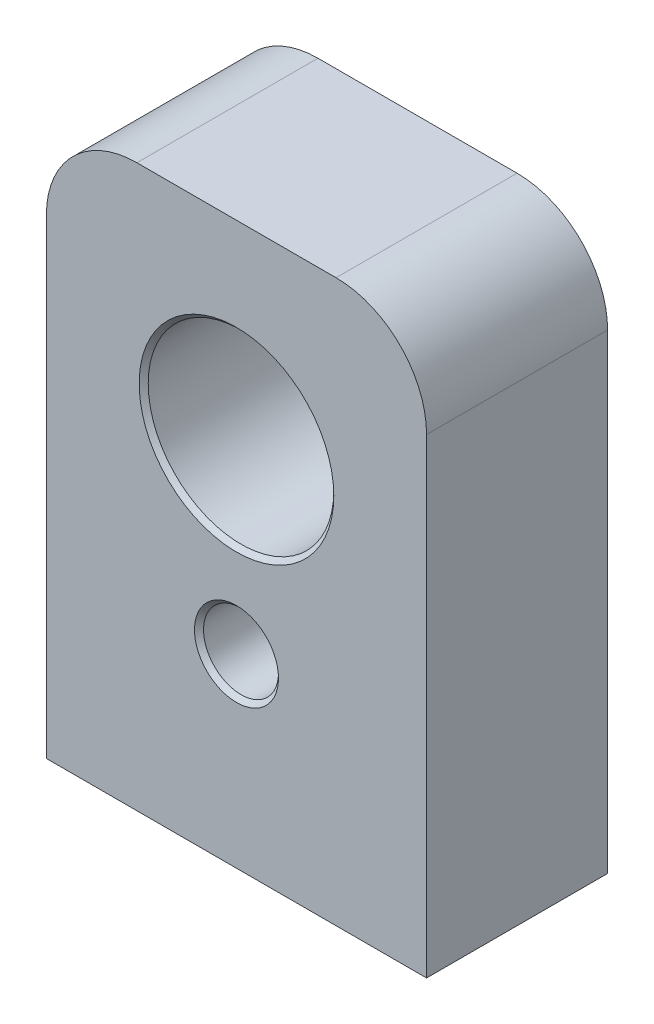
ISO-10303-21;
HEADER;
FILE_DESCRIPTION(('STEP AP214'),'2;1');
FILE_NAME('part.step','',(''),(''),'','','');
FILE_SCHEMA(('AUTOMOTIVE_DESIGN { 1 0 10303 214 1 1 1 1 }'));
ENDSEC;
DATA;
#1=APPLICATION_CONTEXT('core data for automotive mechanical design processes');
#2=APPLICATION_PROTOCOL_DEFINITION('international standard','automotive_design',2000,#1);
#3=PRODUCT_CONTEXT('',#1,'mechanical');
#4=PRODUCT('Part','Part','',(#3));
#5=PRODUCT_RELATED_PRODUCT_CATEGORY('part','',(#4));
#6=PRODUCT_DEFINITION_FORMATION('','',#4);
#7=PRODUCT_DEFINITION_CONTEXT('part definition',#1,'design');
#8=PRODUCT_DEFINITION('design','',#6,#7);
#9=PRODUCT_DEFINITION_SHAPE('','',#8);
#10=(LENGTH_UNIT() NAMED_UNIT(*) SI_UNIT(.MILLI.,.METRE.));
#11=(NAMED_UNIT(*) PLANE_ANGLE_UNIT() SI_UNIT($,.RADIAN.));
#12=(NAMED_UNIT(*) SI_UNIT($,.STERADIAN.) SOLID_ANGLE_UNIT());
#13=UNCERTAINTY_MEASURE_WITH_UNIT(LENGTH_MEASURE(1.E-05),#10,'distance_accuracy_value','');
#14=(GEOMETRIC_REPRESENTATION_CONTEXT(3) GLOBAL_UNCERTAINTY_ASSIGNED_CONTEXT((#13)) GLOBAL_UNIT_ASSIGNED_CONTEXT((#10,
#11,#12)) REPRESENTATION_CONTEXT('',''));
#15=CARTESIAN_POINT('',(0.,0.,0.));
#16=DIRECTION('',(0.,0.,1.));
#17=DIRECTION('',(1.,0.,0.));
#18=AXIS2_PLACEMENT_3D('',#15,#16,#17);
#19=CARTESIAN_POINT('',(-39.44489648097,-31.5193474057694,-10.));
#20=DIRECTION('',(0.,-1.,0.));
#21=DIRECTION('',(1.,0.,0.));
#22=AXIS2_PLACEMENT_3D('',#19,#20,#21);
#23=PLANE('',#22);
#24=DIRECTION('',(-0.866025403784438,0.,0.5));
#25=VECTOR('',#24,1.);
#26=CARTESIAN_POINT('',(-30.6303139186706,-31.5193474057694,1.625));
#27=LINE('',#26,#25);
#28=CARTESIAN_POINT('',(-30.6303139186706,-31.5193474057694,1.625));
#29=VERTEX_POINT('',#28);
#30=CARTESIAN_POINT('',(-33.44489648097,-31.5193474057694,3.25));
#31=VERTEX_POINT('',#30);
#32=EDGE_CURVE('E59',#29,#31,#27,.T.);
#33=ORIENTED_EDGE('',*,*,#32,.F.);
#34=DIRECTION('',(0.,0.,1.));
#35=VECTOR('',#34,1.);
#36=CARTESIAN_POINT('',(-30.6303139186706,-31.5193474057694,-1.625));
#37=LINE('',#36,#35);
#38=CARTESIAN_POINT('',(-30.6303139186706,-31.5193474057694,-1.625));
#39=VERTEX_POINT('',#38);
#40=EDGE_CURVE('E218',#39,#29,#37,.T.);
#41=ORIENTED_EDGE('',*,*,#40,.F.);
#42=DIRECTION('',(0.866025403784439,0.,0.5));
#43=VECTOR('',#42,1.);
#44=CARTESIAN_POINT('',(-33.44489648097,-31.5193474057694,-3.25));
#45=LINE('',#44,#43);
#46=CARTESIAN_POINT('',(-33.44489648097,-31.5193474057694,-3.25));
#47=VERTEX_POINT('',#46);
#48=EDGE_CURVE('E244',#47,#39,#45,.T.);
#49=ORIENTED_EDGE('',*,*,#48,.F.);
#50=DIRECTION('',(0.866025403784438,0.,-0.5));
#51=VECTOR('',#50,1.);
#52=CARTESIAN_POINT('',(-36.2594790432695,-31.5193474057694,-1.625));
#53=LINE('',#52,#51);
#54=CARTESIAN_POINT('',(-36.2594790432695,-31.5193474057694,-1.625));
#55=VERTEX_POINT('',#54);
#56=EDGE_CURVE('E241',#55,#47,#53,.T.);
#57=ORIENTED_EDGE('',*,*,#56,.F.);
#58=DIRECTION('',(0.,0.,-1.));
#59=VECTOR('',#58,1.);
#60=CARTESIAN_POINT('',(-36.2594790432695,-31.5193474057694,1.625));
#61=LINE('',#60,#59);
#62=CARTESIAN_POINT('',(-36.2594790432695,-31.5193474057694,1.625));
#63=VERTEX_POINT('',#62);
#64=EDGE_CURVE('E238',#63,#55,#61,.T.);
#65=ORIENTED_EDGE('',*,*,#64,.F.);
#66=DIRECTION('',(-0.866025403784439,0.,-0.5));
#67=VECTOR('',#66,1.);
#68=CARTESIAN_POINT('',(-33.44489648097,-31.5193474057694,3.25));
#69=LINE('',#68,#67);
#70=EDGE_CURVE('E235',#31,#63,#69,.T.);
#71=ORIENTED_EDGE('',*,*,#70,.F.);
#72=EDGE_LOOP('',(#33,#41,#49,#57,#65,#71));
#73=FACE_BOUND('',#72,.T.);
#74=DIRECTION('',(1.,0.,0.));
#75=VECTOR('',#74,1.);
#76=CARTESIAN_POINT('',(-39.44489648097,-31.5193474057694,10.));
#77=LINE('',#76,#75);
#78=CARTESIAN_POINT('',(-39.44489648097,-31.5193474057694,10.));
#79=VERTEX_POINT('',#78);
#80=CARTESIAN_POINT('',(2.55510351902963,-31.5193474057693,10.));
#81=VERTEX_POINT('',#80);
#82=EDGE_CURVE('E251',#79,#81,#77,.T.);
#83=ORIENTED_EDGE('',*,*,#82,.F.);
#84=DIRECTION('',(0.,0.,1.));
#85=VECTOR('',#84,1.);
#86=CARTESIAN_POINT('',(-39.44489648097,-31.5193474057694,-10.));
#87=LINE('',#86,#85);
#88=CARTESIAN_POINT('',(-39.44489648097,-31.5193474057694,-10.));
#89=VERTEX_POINT('',#88);
#90=EDGE_CURVE('E297',#89,#79,#87,.T.);
#91=ORIENTED_EDGE('',*,*,#90,.F.);
#92=DIRECTION('',(1.,0.,0.));
#93=VECTOR('',#92,1.);
#94=CARTESIAN_POINT('',(-39.44489648097,-31.5193474057694,-10.));
#95=LINE('',#94,#93);
#96=CARTESIAN_POINT('',(2.55510351902963,-31.5193474057693,-10.));
#97=VERTEX_POINT('',#96);
#98=EDGE_CURVE('E261',#89,#97,#95,.T.);
#99=ORIENTED_EDGE('',*,*,#98,.T.);
#100=DIRECTION('',(0.,0.,1.));
#101=VECTOR('',#100,1.);
#102=CARTESIAN_POINT('',(2.55510351902963,-31.5193474057693,-10.));
#103=LINE('',#102,#101);
#104=EDGE_CURVE('E280',#97,#81,#103,.T.);
#105=ORIENTED_EDGE('',*,*,#104,.T.);
#106=EDGE_LOOP('',(#83,#91,#99,#105));
#107=FACE_BOUND('',#106,.T.);
#108=DIRECTION('',(0.,0.,1.));
#109=VECTOR('',#108,1.);
#110=CARTESIAN_POINT('',(-6.25947904326998,-31.5193474057692,-1.625));
#111=LINE('',#110,#109);
#112=CARTESIAN_POINT('',(-6.25947904326998,-31.5193474057692,-1.625));
#113=VERTEX_POINT('',#112);
#114=CARTESIAN_POINT('',(-6.25947904326998,-31.5193474057693,1.625));
#115=VERTEX_POINT('',#114);
#116=EDGE_CURVE('E195',#113,#115,#111,.T.);
#117=ORIENTED_EDGE('',*,*,#116,.T.);
#118=DIRECTION('',(0.866025403784438,0.,0.5));
#119=VECTOR('',#118,1.);
#120=CARTESIAN_POINT('',(-6.25947904326998,-31.5193474057692,1.625));
#121=LINE('',#120,#119);
#122=CARTESIAN_POINT('',(-3.44489648097056,-31.5193474057692,3.25));
#123=VERTEX_POINT('',#122);
#124=EDGE_CURVE('E51',#115,#123,#121,.T.);
#125=ORIENTED_EDGE('',*,*,#124,.T.);
#126=DIRECTION('',(0.866025403784439,0.,-0.5));
#127=VECTOR('',#126,1.);
#128=CARTESIAN_POINT('',(-3.44489648097056,-31.5193474057692,3.25));
#129=LINE('',#128,#127);
#130=CARTESIAN_POINT('',(-0.630313918671126,-31.5193474057692,1.625));
#131=VERTEX_POINT('',#130);
#132=EDGE_CURVE('E182',#123,#131,#129,.T.);
#133=ORIENTED_EDGE('',*,*,#132,.T.);
#134=DIRECTION('',(0.,0.,-1.));
#135=VECTOR('',#134,1.);
#136=CARTESIAN_POINT('',(-0.630313918671126,-31.5193474057692,1.625));
#137=LINE('',#136,#135);
#138=CARTESIAN_POINT('',(-0.630313918671126,-31.5193474057692,-1.625));
#139=VERTEX_POINT('',#138);
#140=EDGE_CURVE('E185',#131,#139,#137,.T.);
#141=ORIENTED_EDGE('',*,*,#140,.T.);
#142=DIRECTION('',(-0.866025403784438,0.,-0.5));
#143=VECTOR('',#142,1.);
#144=CARTESIAN_POINT('',(-0.630313918671126,-31.5193474057692,-1.625));
#145=LINE('',#144,#143);
#146=CARTESIAN_POINT('',(-3.44489648097055,-31.5193474057692,-3.25));
#147=VERTEX_POINT('',#146);
#148=EDGE_CURVE('E200',#139,#147,#145,.T.);
#149=ORIENTED_EDGE('',*,*,#148,.T.);
#150=DIRECTION('',(-0.866025403784439,0.,0.5));
#151=VECTOR('',#150,1.);
#152=CARTESIAN_POINT('',(-3.44489648097055,-31.5193474057692,-3.25));
#153=LINE('',#152,#151);
#154=EDGE_CURVE('E197',#147,#113,#153,.T.);
#155=ORIENTED_EDGE('',*,*,#154,.T.);
#156=EDGE_LOOP('',(#117,#125,#133,#141,#149,#155));
#157=FACE_BOUND('',#156,.T.);
#158=ADVANCED_FACE('F35',(#73,#107,#157),#23,.T.);
#159=CARTESIAN_POINT('',(-39.4448964809704,20.4806525942305,-10.));
#160=DIRECTION('',(-1.,0.,0.));
#161=DIRECTION('',(0.,-1.,0.));
#162=AXIS2_PLACEMENT_3D('',#159,#160,#161);
#163=PLANE('',#162);
#164=DIRECTION('',(0.,-1.,0.));
#165=VECTOR('',#164,1.);
#166=CARTESIAN_POINT('',(-39.4448964809704,20.4806525942305,10.));
#167=LINE('',#166,#165);
#168=CARTESIAN_POINT('',(-39.4448964809704,20.4806525942305,10.));
#169=VERTEX_POINT('',#168);
#170=EDGE_CURVE('E265',#169,#79,#167,.T.);
#171=ORIENTED_EDGE('',*,*,#170,.F.);
#172=DIRECTION('',(0.,0.,1.));
#173=VECTOR('',#172,1.);
#174=CARTESIAN_POINT('',(-39.4448964809704,20.4806525942305,-10.));
#175=LINE('',#174,#173);
#176=CARTESIAN_POINT('',(-39.4448964809704,20.4806525942305,-10.));
#177=VERTEX_POINT('',#176);
#178=EDGE_CURVE('E300',#177,#169,#175,.T.);
#179=ORIENTED_EDGE('',*,*,#178,.F.);
#180=DIRECTION('',(0.,-1.,0.));
#181=VECTOR('',#180,1.);
#182=CARTESIAN_POINT('',(-39.4448964809704,20.4806525942305,-10.));
#183=LINE('',#182,#181);
#184=EDGE_CURVE('E277',#177,#89,#183,.T.);
#185=ORIENTED_EDGE('',*,*,#184,.T.);
#186=ORIENTED_EDGE('',*,*,#90,.T.);
#187=EDGE_LOOP('',(#171,#179,#185,#186));
#188=FACE_BOUND('',#187,.T.);
#189=ADVANCED_FACE('F344',(#188),#163,.T.);
#190=CARTESIAN_POINT('',(-29.4448964809704,20.4806525942305,-10.));
#191=DIRECTION('',(0.,0.,1.));
#192=DIRECTION('',(1.,0.,0.));
#193=AXIS2_PLACEMENT_3D('',#190,#191,#192);
#194=CYLINDRICAL_SURFACE('',#193,10.);
#195=CARTESIAN_POINT('',(-29.4448964809704,20.4806525942305,10.));
#196=DIRECTION('',(0.,0.,1.));
#197=DIRECTION('',(-1.,0.,0.));
#198=AXIS2_PLACEMENT_3D('',#195,#196,#197);
#199=CIRCLE('',#198,10.);
#200=CARTESIAN_POINT('',(-29.4448964809704,30.4806525942305,10.));
#201=VERTEX_POINT('',#200);
#202=EDGE_CURVE('E292',#201,#169,#199,.T.);
#203=ORIENTED_EDGE('',*,*,#202,.F.);
#204=DIRECTION('',(0.,0.,1.));
#205=VECTOR('',#204,1.);
#206=CARTESIAN_POINT('',(-29.4448964809704,30.4806525942305,-10.));
#207=LINE('',#206,#205);
#208=CARTESIAN_POINT('',(-29.4448964809704,30.4806525942305,-10.));
#209=VERTEX_POINT('',#208);
#210=EDGE_CURVE('E302',#209,#201,#207,.T.);
#211=ORIENTED_EDGE('',*,*,#210,.F.);
#212=CARTESIAN_POINT('',(-29.4448964809704,20.4806525942305,-10.));
#213=DIRECTION('',(0.,0.,1.));
#214=DIRECTION('',(-1.,0.,0.));
#215=AXIS2_PLACEMENT_3D('',#212,#213,#214);
#216=CIRCLE('',#215,10.);
#217=EDGE_CURVE('E274',#209,#177,#216,.T.);
#218=ORIENTED_EDGE('',*,*,#217,.T.);
#219=ORIENTED_EDGE('',*,*,#178,.T.);
#220=EDGE_LOOP('',(#203,#211,#218,#219));
#221=FACE_BOUND('',#220,.T.);
#222=ADVANCED_FACE('F350',(#221),#194,.T.);
#223=CARTESIAN_POINT('',(-7.44489648097042,30.4806525942305,-10.));
#224=DIRECTION('',(0.,1.,0.));
#225=DIRECTION('',(0.,0.,1.));
#226=AXIS2_PLACEMENT_3D('',#223,#224,#225);
#227=PLANE('',#226);
#228=DIRECTION('',(-1.,0.,0.));
#229=VECTOR('',#228,1.);
#230=CARTESIAN_POINT('',(-7.44489648097042,30.4806525942305,10.));
#231=LINE('',#230,#229);
#232=CARTESIAN_POINT('',(-7.44489648097042,30.4806525942305,10.));
#233=VERTEX_POINT('',#232);
#234=EDGE_CURVE('E289',#233,#201,#231,.T.);
#235=ORIENTED_EDGE('',*,*,#234,.F.);
#236=DIRECTION('',(0.,0.,1.));
#237=VECTOR('',#236,1.);
#238=CARTESIAN_POINT('',(-7.44489648097042,30.4806525942305,-10.));
#239=LINE('',#238,#237);
#240=CARTESIAN_POINT('',(-7.44489648097042,30.4806525942305,-10.));
#241=VERTEX_POINT('',#240);
#242=EDGE_CURVE('E304',#241,#233,#239,.T.);
#243=ORIENTED_EDGE('',*,*,#242,.F.);
#244=DIRECTION('',(-1.,0.,0.));
#245=VECTOR('',#244,1.);
#246=CARTESIAN_POINT('',(-7.44489648097042,30.4806525942305,-10.));
#247=LINE('',#246,#245);
#248=EDGE_CURVE('E271',#241,#209,#247,.T.);
#249=ORIENTED_EDGE('',*,*,#248,.T.);
#250=ORIENTED_EDGE('',*,*,#210,.T.);
#251=EDGE_LOOP('',(#235,#243,#249,#250));
#252=FACE_BOUND('',#251,.T.);
#253=ADVANCED_FACE('F401',(#252),#227,.T.);
#254=CARTESIAN_POINT('',(-7.44489648097042,20.4806525942305,-10.));
#255=DIRECTION('',(0.,0.,1.));
#256=DIRECTION('',(1.,0.,0.));
#257=AXIS2_PLACEMENT_3D('',#254,#255,#256);
#258=CYLINDRICAL_SURFACE('',#257,10.);
#259=CARTESIAN_POINT('',(-7.44489648097042,20.4806525942305,10.));
#260=DIRECTION('',(0.,0.,1.));
#261=DIRECTION('',(1.,0.,0.));
#262=AXIS2_PLACEMENT_3D('',#259,#260,#261);
#263=CIRCLE('',#262,10.);
#264=CARTESIAN_POINT('',(2.55510351902959,20.4806525942305,10.));
#265=VERTEX_POINT('',#264);
#266=EDGE_CURVE('E286',#265,#233,#263,.T.);
#267=ORIENTED_EDGE('',*,*,#266,.F.);
#268=DIRECTION('',(0.,0.,1.));
#269=VECTOR('',#268,1.);
#270=CARTESIAN_POINT('',(2.55510351902959,20.4806525942305,-10.));
#271=LINE('',#270,#269);
#272=CARTESIAN_POINT('',(2.55510351902959,20.4806525942305,-10.));
#273=VERTEX_POINT('',#272);
#274=EDGE_CURVE('E306',#273,#265,#271,.T.);
#275=ORIENTED_EDGE('',*,*,#274,.F.);
#276=CARTESIAN_POINT('',(-7.44489648097042,20.4806525942305,-10.));
#277=DIRECTION('',(0.,0.,1.));
#278=DIRECTION('',(1.,0.,0.));
#279=AXIS2_PLACEMENT_3D('',#276,#277,#278);
#280=CIRCLE('',#279,10.);
#281=EDGE_CURVE('E268',#273,#241,#280,.T.);
#282=ORIENTED_EDGE('',*,*,#281,.T.);
#283=ORIENTED_EDGE('',*,*,#242,.T.);
#284=EDGE_LOOP('',(#267,#275,#282,#283));
#285=FACE_BOUND('',#284,.T.);
#286=ADVANCED_FACE('F404',(#285),#258,.T.);
#287=CARTESIAN_POINT('',(2.55510351902963,-31.5193474057693,-10.));
#288=DIRECTION('',(1.,0.,0.));
#289=DIRECTION('',(0.,1.,0.));
#290=AXIS2_PLACEMENT_3D('',#287,#288,#289);
#291=PLANE('',#290);
#292=DIRECTION('',(0.,1.,0.));
#293=VECTOR('',#292,1.);
#294=CARTESIAN_POINT('',(2.55510351902963,-31.5193474057693,10.));
#295=LINE('',#294,#293);
#296=EDGE_CURVE('E283',#81,#265,#295,.T.);
#297=ORIENTED_EDGE('',*,*,#296,.F.);
#298=ORIENTED_EDGE('',*,*,#104,.F.);
#299=DIRECTION('',(0.,1.,0.));
#300=VECTOR('',#299,1.);
#301=CARTESIAN_POINT('',(2.55510351902963,-31.5193474057693,-10.));
#302=LINE('',#301,#300);
#303=EDGE_CURVE('E264',#97,#273,#302,.T.);
#304=ORIENTED_EDGE('',*,*,#303,.T.);
#305=ORIENTED_EDGE('',*,*,#274,.T.);
#306=EDGE_LOOP('',(#297,#298,#304,#305));
#307=FACE_BOUND('',#306,.T.);
#308=ADVANCED_FACE('F356',(#307),#291,.T.);
#309=CARTESIAN_POINT('',(-7.44489648097042,20.4806525942305,-10.));
#310=DIRECTION('',(0.,0.,1.));
#311=DIRECTION('',(1.,0.,0.));
#312=AXIS2_PLACEMENT_3D('',#309,#310,#311);
#313=PLANE('',#312);
#314=CARTESIAN_POINT('',(-18.4448964809706,9.48065259423065,-10.));
#315=DIRECTION('',(0.,0.,1.));
#316=DIRECTION('',(1.,0.,0.));
#317=AXIS2_PLACEMENT_3D('',#314,#315,#316);
#318=CIRCLE('',#317,10.75);
#319=CARTESIAN_POINT('',(-7.69489648097064,9.48065259423065,-10.));
#320=VERTEX_POINT('',#319);
#321=EDGE_CURVE('E323',#320,#320,#318,.T.);
#322=ORIENTED_EDGE('',*,*,#321,.T.);
#323=EDGE_LOOP('',(#322));
#324=FACE_BOUND('',#323,.T.);
#325=CARTESIAN_POINT('',(-18.4448964809706,-11.0193474057693,-10.));
#326=DIRECTION('',(0.,0.,1.));
#327=DIRECTION('',(1.,0.,0.));
#328=AXIS2_PLACEMENT_3D('',#325,#326,#327);
#329=CIRCLE('',#328,4.64);
#330=CARTESIAN_POINT('',(-13.8048964809706,-11.0193474057693,-10.));
#331=VERTEX_POINT('',#330);
#332=EDGE_CURVE('E320',#331,#331,#329,.T.);
#333=ORIENTED_EDGE('',*,*,#332,.T.);
#334=EDGE_LOOP('',(#333));
#335=FACE_BOUND('',#334,.T.);
#336=ORIENTED_EDGE('',*,*,#98,.F.);
#337=ORIENTED_EDGE('',*,*,#184,.F.);
#338=ORIENTED_EDGE('',*,*,#217,.F.);
#339=ORIENTED_EDGE('',*,*,#248,.F.);
#340=ORIENTED_EDGE('',*,*,#281,.F.);
#341=ORIENTED_EDGE('',*,*,#303,.F.);
#342=EDGE_LOOP('',(#336,#337,#338,#339,#340,#341));
#343=FACE_BOUND('',#342,.T.);
#344=ADVANCED_FACE('F382',(#324,#335,#343),#313,.F.);
#345=CARTESIAN_POINT('',(-7.44489648097042,20.4806525942305,10.));
#346=DIRECTION('',(0.,0.,1.));
#347=DIRECTION('',(1.,0.,0.));
#348=AXIS2_PLACEMENT_3D('',#345,#346,#347);
#349=PLANE('',#348);
#350=CARTESIAN_POINT('',(-18.4448964809706,9.48065259423065,10.));
#351=DIRECTION('',(0.,0.,1.));
#352=DIRECTION('',(1.,0.,0.));
#353=AXIS2_PLACEMENT_3D('',#350,#351,#352);
#354=CIRCLE('',#353,10.75);
#355=CARTESIAN_POINT('',(-7.69489648097064,9.48065259423065,10.));
#356=VERTEX_POINT('',#355);
#357=EDGE_CURVE('E317',#356,#356,#354,.F.);
#358=ORIENTED_EDGE('',*,*,#357,.T.);
#359=EDGE_LOOP('',(#358));
#360=FACE_BOUND('',#359,.T.);
#361=CARTESIAN_POINT('',(-18.4448964809706,-11.0193474057693,10.));
#362=DIRECTION('',(0.,0.,1.));
#363=DIRECTION('',(1.,0.,0.));
#364=AXIS2_PLACEMENT_3D('',#361,#362,#363);
#365=CIRCLE('',#364,4.63999999999998);
#366=CARTESIAN_POINT('',(-13.8048964809706,-11.0193474057693,10.));
#367=VERTEX_POINT('',#366);
#368=EDGE_CURVE('E314',#367,#367,#365,.F.);
#369=ORIENTED_EDGE('',*,*,#368,.T.);
#370=EDGE_LOOP('',(#369));
#371=FACE_BOUND('',#370,.T.);
#372=ORIENTED_EDGE('',*,*,#82,.T.);
#373=ORIENTED_EDGE('',*,*,#296,.T.);
#374=ORIENTED_EDGE('',*,*,#266,.T.);
#375=ORIENTED_EDGE('',*,*,#234,.T.);
#376=ORIENTED_EDGE('',*,*,#202,.T.);
#377=ORIENTED_EDGE('',*,*,#170,.T.);
#378=EDGE_LOOP('',(#372,#373,#374,#375,#376,#377));
#379=FACE_BOUND('',#378,.T.);
#380=ADVANCED_FACE('F385',(#360,#371,#379),#349,.T.);
#381=CARTESIAN_POINT('',(-18.4448964809706,-11.0193474057693,-10.));
#382=DIRECTION('',(0.,0.,1.));
#383=DIRECTION('',(1.,0.,0.));
#384=AXIS2_PLACEMENT_3D('',#381,#382,#383);
#385=CYLINDRICAL_SURFACE('',#384,4.14);
#386=CARTESIAN_POINT('',(-18.4448964809706,-11.0193474057693,-9.49999999999999));
#387=DIRECTION('',(0.,0.,1.));
#388=DIRECTION('',(1.,0.,0.));
#389=AXIS2_PLACEMENT_3D('',#386,#387,#388);
#390=CIRCLE('',#389,4.14);
#391=CARTESIAN_POINT('',(-14.3048964809706,-11.0193474057693,-9.49999999999999));
#392=VERTEX_POINT('',#391);
#393=EDGE_CURVE('E11',#392,#392,#390,.F.);
#394=ORIENTED_EDGE('',*,*,#393,.T.);
#395=EDGE_LOOP('',(#394));
#396=FACE_BOUND('',#395,.T.);
#397=CARTESIAN_POINT('',(-18.4448964809706,-11.0193474057693,9.50000000000002));
#398=DIRECTION('',(0.,0.,1.));
#399=DIRECTION('',(1.,0.,0.));
#400=AXIS2_PLACEMENT_3D('',#397,#398,#399);
#401=CIRCLE('',#400,4.14);
#402=CARTESIAN_POINT('',(-14.3048964809706,-11.0193474057693,9.50000000000002));
#403=VERTEX_POINT('',#402);
#404=EDGE_CURVE('E44',#403,#403,#401,.T.);
#405=ORIENTED_EDGE('',*,*,#404,.T.);
#406=EDGE_LOOP('',(#405));
#407=FACE_BOUND('',#406,.T.);
#408=ADVANCED_FACE('F328',(#396,#407),#385,.F.);
#409=CARTESIAN_POINT('',(-18.4448964809706,9.48065259423065,-10.));
#410=DIRECTION('',(0.,0.,1.));
#411=DIRECTION('',(1.,0.,0.));
#412=AXIS2_PLACEMENT_3D('',#409,#410,#411);
#413=CYLINDRICAL_SURFACE('',#412,10.25);
#414=CARTESIAN_POINT('',(-18.4448964809706,9.48065259423065,9.5));
#415=DIRECTION('',(0.,0.,1.));
#416=DIRECTION('',(1.,0.,0.));
#417=AXIS2_PLACEMENT_3D('',#414,#415,#416);
#418=CIRCLE('',#417,10.25);
#419=CARTESIAN_POINT('',(-8.19489648097064,9.48065259423065,9.5));
#420=VERTEX_POINT('',#419);
#421=EDGE_CURVE('E311',#420,#420,#418,.T.);
#422=ORIENTED_EDGE('',*,*,#421,.T.);
#423=EDGE_LOOP('',(#422));
#424=FACE_BOUND('',#423,.T.);
#425=CARTESIAN_POINT('',(-18.4448964809706,9.48065259423065,-9.49999999999999));
#426=DIRECTION('',(0.,0.,1.));
#427=DIRECTION('',(1.,0.,0.));
#428=AXIS2_PLACEMENT_3D('',#425,#426,#427);
#429=CIRCLE('',#428,10.25);
#430=CARTESIAN_POINT('',(-8.19489648097064,9.48065259423065,-9.49999999999999));
#431=VERTEX_POINT('',#430);
#432=EDGE_CURVE('E299',#431,#431,#429,.F.);
#433=ORIENTED_EDGE('',*,*,#432,.T.);
#434=EDGE_LOOP('',(#433));
#435=FACE_BOUND('',#434,.T.);
#436=ADVANCED_FACE('F365',(#424,#435),#413,.F.);
#437=CARTESIAN_POINT('',(-18.4448964809706,9.48065259423065,9.5));
#438=DIRECTION('',(0.,0.,1.));
#439=DIRECTION('',(1.,0.,0.));
#440=AXIS2_PLACEMENT_3D('',#437,#438,#439);
#441=CONICAL_SURFACE('',#440,10.25,0.785398163397453);
#442=ORIENTED_EDGE('',*,*,#357,.F.);
#443=EDGE_LOOP('',(#442));
#444=FACE_BOUND('',#443,.T.);
#445=ORIENTED_EDGE('',*,*,#421,.F.);
#446=EDGE_LOOP('',(#445));
#447=FACE_BOUND('',#446,.T.);
#448=ADVANCED_FACE('F359',(#444,#447),#441,.F.);
#449=CARTESIAN_POINT('',(-18.4448964809706,9.48065259423065,-10.));
#450=DIRECTION('',(0.,0.,-1.));
#451=DIRECTION('',(-1.,0.,0.));
#452=AXIS2_PLACEMENT_3D('',#449,#450,#451);
#453=CONICAL_SURFACE('',#452,10.75,0.785398163397443);
#454=ORIENTED_EDGE('',*,*,#432,.F.);
#455=EDGE_LOOP('',(#454));
#456=FACE_BOUND('',#455,.T.);
#457=ORIENTED_EDGE('',*,*,#321,.F.);
#458=EDGE_LOOP('',(#457));
#459=FACE_BOUND('',#458,.T.);
#460=ADVANCED_FACE('F340',(#456,#459),#453,.F.);
#461=CARTESIAN_POINT('',(-18.4448964809706,-11.0193474057693,-10.));
#462=DIRECTION('',(0.,0.,-1.));
#463=DIRECTION('',(-1.,0.,0.));
#464=AXIS2_PLACEMENT_3D('',#461,#462,#463);
#465=CONICAL_SURFACE('',#464,4.64,0.785398163397434);
#466=ORIENTED_EDGE('',*,*,#393,.F.);
#467=EDGE_LOOP('',(#466));
#468=FACE_BOUND('',#467,.T.);
#469=ORIENTED_EDGE('',*,*,#332,.F.);
#470=EDGE_LOOP('',(#469));
#471=FACE_BOUND('',#470,.T.);
#472=ADVANCED_FACE('F332',(#468,#471),#465,.F.);
#473=CARTESIAN_POINT('',(-18.4448964809706,-11.0193474057693,9.50000000000002));
#474=DIRECTION('',(0.,0.,1.));
#475=DIRECTION('',(1.,0.,0.));
#476=AXIS2_PLACEMENT_3D('',#473,#474,#475);
#477=CONICAL_SURFACE('',#476,4.14,0.785398163397448);
#478=ORIENTED_EDGE('',*,*,#368,.F.);
#479=EDGE_LOOP('',(#478));
#480=FACE_BOUND('',#479,.T.);
#481=ORIENTED_EDGE('',*,*,#404,.F.);
#482=EDGE_LOOP('',(#481));
#483=FACE_BOUND('',#482,.T.);
#484=ADVANCED_FACE('F38',(#480,#483),#477,.F.);
#485=CARTESIAN_POINT('',(-30.6303139186706,-16.0193474057694,1.625));
#486=DIRECTION('',(0.5,0.,0.866025403784438));
#487=DIRECTION('',(0.866025403784438,0.,-0.5));
#488=AXIS2_PLACEMENT_3D('',#485,#486,#487);
#489=PLANE('',#488);
#490=ORIENTED_EDGE('',*,*,#32,.T.);
#491=DIRECTION('',(0.,-1.,0.));
#492=VECTOR('',#491,1.);
#493=CARTESIAN_POINT('',(-33.44489648097,-16.0193474057694,3.25));
#494=LINE('',#493,#492);
#495=CARTESIAN_POINT('',(-33.44489648097,-16.0193474057694,3.25));
#496=VERTEX_POINT('',#495);
#497=EDGE_CURVE('E233',#496,#31,#494,.T.);
#498=ORIENTED_EDGE('',*,*,#497,.F.);
#499=DIRECTION('',(-0.866025403784438,0.,0.5));
#500=VECTOR('',#499,1.);
#501=CARTESIAN_POINT('',(-30.6303139186706,-16.0193474057694,1.625));
#502=LINE('',#501,#500);
#503=CARTESIAN_POINT('',(-30.6303139186706,-16.0193474057694,1.625));
#504=VERTEX_POINT('',#503);
#505=EDGE_CURVE('E214',#504,#496,#502,.T.);
#506=ORIENTED_EDGE('',*,*,#505,.F.);
#507=DIRECTION('',(0.,-1.,0.));
#508=VECTOR('',#507,1.);
#509=CARTESIAN_POINT('',(-30.6303139186706,-16.0193474057694,1.625));
#510=LINE('',#509,#508);
#511=EDGE_CURVE('E249',#504,#29,#510,.T.);
#512=ORIENTED_EDGE('',*,*,#511,.T.);
#513=EDGE_LOOP('',(#490,#498,#506,#512));
#514=FACE_BOUND('',#513,.T.);
#515=ADVANCED_FACE('F331',(#514),#489,.F.);
#516=CARTESIAN_POINT('',(-30.6303139186706,-16.0193474057694,-1.625));
#517=DIRECTION('',(1.,0.,0.));
#518=DIRECTION('',(0.,1.,0.));
#519=AXIS2_PLACEMENT_3D('',#516,#517,#518);
#520=PLANE('',#519);
#521=ORIENTED_EDGE('',*,*,#40,.T.);
#522=ORIENTED_EDGE('',*,*,#511,.F.);
#523=DIRECTION('',(0.,0.,1.));
#524=VECTOR('',#523,1.);
#525=CARTESIAN_POINT('',(-30.6303139186706,-16.0193474057694,-1.625));
#526=LINE('',#525,#524);
#527=CARTESIAN_POINT('',(-30.6303139186706,-16.0193474057694,-1.625));
#528=VERTEX_POINT('',#527);
#529=EDGE_CURVE('E230',#528,#504,#526,.T.);
#530=ORIENTED_EDGE('',*,*,#529,.F.);
#531=DIRECTION('',(0.,-1.,0.));
#532=VECTOR('',#531,1.);
#533=CARTESIAN_POINT('',(-30.6303139186706,-16.0193474057694,-1.625));
#534=LINE('',#533,#532);
#535=EDGE_CURVE('E252',#528,#39,#534,.T.);
#536=ORIENTED_EDGE('',*,*,#535,.T.);
#537=EDGE_LOOP('',(#521,#522,#530,#536));
#538=FACE_BOUND('',#537,.T.);
#539=ADVANCED_FACE('F338',(#538),#520,.F.);
#540=CARTESIAN_POINT('',(-33.44489648097,-16.0193474057694,-3.25));
#541=DIRECTION('',(0.5,0.,-0.866025403784439));
#542=DIRECTION('',(-0.866025403784439,0.,-0.5));
#543=AXIS2_PLACEMENT_3D('',#540,#541,#542);
#544=PLANE('',#543);
#545=ORIENTED_EDGE('',*,*,#48,.T.);
#546=ORIENTED_EDGE('',*,*,#535,.F.);
#547=DIRECTION('',(0.866025403784439,0.,0.5));
#548=VECTOR('',#547,1.);
#549=CARTESIAN_POINT('',(-33.44489648097,-16.0193474057694,-3.25));
#550=LINE('',#549,#548);
#551=CARTESIAN_POINT('',(-33.44489648097,-16.0193474057694,-3.25));
#552=VERTEX_POINT('',#551);
#553=EDGE_CURVE('E227',#552,#528,#550,.T.);
#554=ORIENTED_EDGE('',*,*,#553,.F.);
#555=DIRECTION('',(0.,-1.,0.));
#556=VECTOR('',#555,1.);
#557=CARTESIAN_POINT('',(-33.44489648097,-16.0193474057694,-3.25));
#558=LINE('',#557,#556);
#559=EDGE_CURVE('E254',#552,#47,#558,.T.);
#560=ORIENTED_EDGE('',*,*,#559,.T.);
#561=EDGE_LOOP('',(#545,#546,#554,#560));
#562=FACE_BOUND('',#561,.T.);
#563=ADVANCED_FACE('F486',(#562),#544,.F.);
#564=CARTESIAN_POINT('',(-36.2594790432695,-16.0193474057694,-1.625));
#565=DIRECTION('',(-0.5,0.,-0.866025403784439));
#566=DIRECTION('',(-0.866025403784439,0.,0.5));
#567=AXIS2_PLACEMENT_3D('',#564,#565,#566);
#568=PLANE('',#567);
#569=ORIENTED_EDGE('',*,*,#56,.T.);
#570=ORIENTED_EDGE('',*,*,#559,.F.);
#571=DIRECTION('',(0.866025403784438,0.,-0.5));
#572=VECTOR('',#571,1.);
#573=CARTESIAN_POINT('',(-36.2594790432695,-16.0193474057694,-1.625));
#574=LINE('',#573,#572);
#575=CARTESIAN_POINT('',(-36.2594790432695,-16.0193474057694,-1.625));
#576=VERTEX_POINT('',#575);
#577=EDGE_CURVE('E224',#576,#552,#574,.T.);
#578=ORIENTED_EDGE('',*,*,#577,.F.);
#579=DIRECTION('',(0.,-1.,0.));
#580=VECTOR('',#579,1.);
#581=CARTESIAN_POINT('',(-36.2594790432695,-16.0193474057694,-1.625));
#582=LINE('',#581,#580);
#583=EDGE_CURVE('E256',#576,#55,#582,.T.);
#584=ORIENTED_EDGE('',*,*,#583,.T.);
#585=EDGE_LOOP('',(#569,#570,#578,#584));
#586=FACE_BOUND('',#585,.T.);
#587=ADVANCED_FACE('F496',(#586),#568,.F.);
#588=CARTESIAN_POINT('',(-36.2594790432695,-16.0193474057694,1.625));
#589=DIRECTION('',(-1.,0.,0.));
#590=DIRECTION('',(0.,-1.,0.));
#591=AXIS2_PLACEMENT_3D('',#588,#589,#590);
#592=PLANE('',#591);
#593=ORIENTED_EDGE('',*,*,#64,.T.);
#594=ORIENTED_EDGE('',*,*,#583,.F.);
#595=DIRECTION('',(0.,0.,-1.));
#596=VECTOR('',#595,1.);
#597=CARTESIAN_POINT('',(-36.2594790432695,-16.0193474057694,1.625));
#598=LINE('',#597,#596);
#599=CARTESIAN_POINT('',(-36.2594790432695,-16.0193474057694,1.625));
#600=VERTEX_POINT('',#599);
#601=EDGE_CURVE('E221',#600,#576,#598,.T.);
#602=ORIENTED_EDGE('',*,*,#601,.F.);
#603=DIRECTION('',(0.,-1.,0.));
#604=VECTOR('',#603,1.);
#605=CARTESIAN_POINT('',(-36.2594790432695,-16.0193474057694,1.625));
#606=LINE('',#605,#604);
#607=EDGE_CURVE('E258',#600,#63,#606,.T.);
#608=ORIENTED_EDGE('',*,*,#607,.T.);
#609=EDGE_LOOP('',(#593,#594,#602,#608));
#610=FACE_BOUND('',#609,.T.);
#611=ADVANCED_FACE('F506',(#610),#592,.F.);
#612=CARTESIAN_POINT('',(-33.44489648097,-16.0193474057694,3.25));
#613=DIRECTION('',(-0.5,0.,0.866025403784439));
#614=DIRECTION('',(0.866025403784439,0.,0.5));
#615=AXIS2_PLACEMENT_3D('',#612,#613,#614);
#616=PLANE('',#615);
#617=ORIENTED_EDGE('',*,*,#70,.T.);
#618=ORIENTED_EDGE('',*,*,#607,.F.);
#619=DIRECTION('',(-0.866025403784439,0.,-0.5));
#620=VECTOR('',#619,1.);
#621=CARTESIAN_POINT('',(-33.44489648097,-16.0193474057694,3.25));
#622=LINE('',#621,#620);
#623=EDGE_CURVE('E217',#496,#600,#622,.T.);
#624=ORIENTED_EDGE('',*,*,#623,.F.);
#625=ORIENTED_EDGE('',*,*,#497,.T.);
#626=EDGE_LOOP('',(#617,#618,#624,#625));
#627=FACE_BOUND('',#626,.T.);
#628=ADVANCED_FACE('F516',(#627),#616,.F.);
#629=CARTESIAN_POINT('',(0.,-16.0193474057694,0.));
#630=DIRECTION('',(0.,-1.,0.));
#631=DIRECTION('',(0.,0.,-1.));
#632=AXIS2_PLACEMENT_3D('',#629,#630,#631);
#633=PLANE('',#632);
#634=ORIENTED_EDGE('',*,*,#505,.T.);
#635=ORIENTED_EDGE('',*,*,#623,.T.);
#636=ORIENTED_EDGE('',*,*,#601,.T.);
#637=ORIENTED_EDGE('',*,*,#577,.T.);
#638=ORIENTED_EDGE('',*,*,#553,.T.);
#639=ORIENTED_EDGE('',*,*,#529,.T.);
#640=EDGE_LOOP('',(#634,#635,#636,#637,#638,#639));
#641=FACE_BOUND('',#640,.T.);
#642=ADVANCED_FACE('F526',(#641),#633,.T.);
#643=CARTESIAN_POINT('',(-6.25947904327012,-16.0193474057692,1.625));
#644=DIRECTION('',(0.5,0.,-0.866025403784438));
#645=DIRECTION('',(-0.866025403784438,0.,-0.5));
#646=AXIS2_PLACEMENT_3D('',#643,#644,#645);
#647=PLANE('',#646);
#648=ORIENTED_EDGE('',*,*,#124,.F.);
#649=DIRECTION('',(0.,-1.,0.));
#650=VECTOR('',#649,1.);
#651=CARTESIAN_POINT('',(-6.25947904327012,-16.0193474057692,1.625));
#652=LINE('',#651,#650);
#653=CARTESIAN_POINT('',(-6.25947904327012,-16.0193474057692,1.625));
#654=VERTEX_POINT('',#653);
#655=EDGE_CURVE('E166',#654,#115,#652,.T.);
#656=ORIENTED_EDGE('',*,*,#655,.F.);
#657=DIRECTION('',(0.866025403784438,0.,0.5));
#658=VECTOR('',#657,1.);
#659=CARTESIAN_POINT('',(-6.25947904327012,-16.0193474057692,1.625));
#660=LINE('',#659,#658);
#661=CARTESIAN_POINT('',(-3.44489648097069,-16.0193474057692,3.25));
#662=VERTEX_POINT('',#661);
#663=EDGE_CURVE('E173',#654,#662,#660,.T.);
#664=ORIENTED_EDGE('',*,*,#663,.T.);
#665=DIRECTION('',(0.,-1.,0.));
#666=VECTOR('',#665,1.);
#667=CARTESIAN_POINT('',(-3.44489648097069,-16.0193474057692,3.25));
#668=LINE('',#667,#666);
#669=EDGE_CURVE('E205',#662,#123,#668,.T.);
#670=ORIENTED_EDGE('',*,*,#669,.T.);
#671=EDGE_LOOP('',(#648,#656,#664,#670));
#672=FACE_BOUND('',#671,.T.);
#673=ADVANCED_FACE('F176',(#672),#647,.T.);
#674=CARTESIAN_POINT('',(-3.44489648097069,-16.0193474057692,3.25));
#675=DIRECTION('',(-0.5,0.,-0.866025403784439));
#676=DIRECTION('',(-0.866025403784439,0.,0.5));
#677=AXIS2_PLACEMENT_3D('',#674,#675,#676);
#678=PLANE('',#677);
#679=ORIENTED_EDGE('',*,*,#132,.F.);
#680=ORIENTED_EDGE('',*,*,#669,.F.);
#681=DIRECTION('',(0.866025403784439,0.,-0.5));
#682=VECTOR('',#681,1.);
#683=CARTESIAN_POINT('',(-3.44489648097069,-16.0193474057692,3.25));
#684=LINE('',#683,#682);
#685=CARTESIAN_POINT('',(-0.630313918671258,-16.0193474057692,1.625));
#686=VERTEX_POINT('',#685);
#687=EDGE_CURVE('E178',#662,#686,#684,.T.);
#688=ORIENTED_EDGE('',*,*,#687,.T.);
#689=DIRECTION('',(0.,-1.,0.));
#690=VECTOR('',#689,1.);
#691=CARTESIAN_POINT('',(-0.630313918671258,-16.0193474057692,1.625));
#692=LINE('',#691,#690);
#693=EDGE_CURVE('E207',#686,#131,#692,.T.);
#694=ORIENTED_EDGE('',*,*,#693,.T.);
#695=EDGE_LOOP('',(#679,#680,#688,#694));
#696=FACE_BOUND('',#695,.T.);
#697=ADVANCED_FACE('F549',(#696),#678,.T.);
#698=CARTESIAN_POINT('',(-0.630313918671258,-16.0193474057692,1.625));
#699=DIRECTION('',(-1.,0.,0.));
#700=DIRECTION('',(0.,-1.,0.));
#701=AXIS2_PLACEMENT_3D('',#698,#699,#700);
#702=PLANE('',#701);
#703=ORIENTED_EDGE('',*,*,#140,.F.);
#704=ORIENTED_EDGE('',*,*,#693,.F.);
#705=DIRECTION('',(0.,0.,-1.));
#706=VECTOR('',#705,1.);
#707=CARTESIAN_POINT('',(-0.630313918671258,-16.0193474057692,1.625));
#708=LINE('',#707,#706);
#709=CARTESIAN_POINT('',(-0.630313918671258,-16.0193474057692,-1.625));
#710=VERTEX_POINT('',#709);
#711=EDGE_CURVE('E191',#686,#710,#708,.T.);
#712=ORIENTED_EDGE('',*,*,#711,.T.);
#713=DIRECTION('',(0.,-1.,0.));
#714=VECTOR('',#713,1.);
#715=CARTESIAN_POINT('',(-0.630313918671258,-16.0193474057692,-1.625));
#716=LINE('',#715,#714);
#717=EDGE_CURVE('E209',#710,#139,#716,.T.);
#718=ORIENTED_EDGE('',*,*,#717,.T.);
#719=EDGE_LOOP('',(#703,#704,#712,#718));
#720=FACE_BOUND('',#719,.T.);
#721=ADVANCED_FACE('F558',(#720),#702,.T.);
#722=CARTESIAN_POINT('',(-0.630313918671258,-16.0193474057692,-1.625));
#723=DIRECTION('',(-0.5,0.,0.866025403784439));
#724=DIRECTION('',(0.866025403784439,0.,0.5));
#725=AXIS2_PLACEMENT_3D('',#722,#723,#724);
#726=PLANE('',#725);
#727=ORIENTED_EDGE('',*,*,#148,.F.);
#728=ORIENTED_EDGE('',*,*,#717,.F.);
#729=DIRECTION('',(-0.866025403784438,0.,-0.5));
#730=VECTOR('',#729,1.);
#731=CARTESIAN_POINT('',(-0.630313918671258,-16.0193474057692,-1.625));
#732=LINE('',#731,#730);
#733=CARTESIAN_POINT('',(-3.44489648097068,-16.0193474057692,-3.25));
#734=VERTEX_POINT('',#733);
#735=EDGE_CURVE('E189',#710,#734,#732,.T.);
#736=ORIENTED_EDGE('',*,*,#735,.T.);
#737=DIRECTION('',(0.,-1.,0.));
#738=VECTOR('',#737,1.);
#739=CARTESIAN_POINT('',(-3.44489648097068,-16.0193474057692,-3.25));
#740=LINE('',#739,#738);
#741=EDGE_CURVE('E211',#734,#147,#740,.T.);
#742=ORIENTED_EDGE('',*,*,#741,.T.);
#743=EDGE_LOOP('',(#727,#728,#736,#742));
#744=FACE_BOUND('',#743,.T.);
#745=ADVANCED_FACE('F568',(#744),#726,.T.);
#746=CARTESIAN_POINT('',(-3.44489648097068,-16.0193474057692,-3.25));
#747=DIRECTION('',(0.5,0.,0.866025403784439));
#748=DIRECTION('',(0.866025403784439,0.,-0.5));
#749=AXIS2_PLACEMENT_3D('',#746,#747,#748);
#750=PLANE('',#749);
#751=ORIENTED_EDGE('',*,*,#154,.F.);
#752=ORIENTED_EDGE('',*,*,#741,.F.);
#753=DIRECTION('',(-0.866025403784439,0.,0.5));
#754=VECTOR('',#753,1.);
#755=CARTESIAN_POINT('',(-3.44489648097068,-16.0193474057692,-3.25));
#756=LINE('',#755,#754);
#757=CARTESIAN_POINT('',(-6.25947904327012,-16.0193474057692,-1.625));
#758=VERTEX_POINT('',#757);
#759=EDGE_CURVE('E172',#734,#758,#756,.T.);
#760=ORIENTED_EDGE('',*,*,#759,.T.);
#761=DIRECTION('',(0.,-1.,0.));
#762=VECTOR('',#761,1.);
#763=CARTESIAN_POINT('',(-6.25947904327012,-16.0193474057692,-1.625));
#764=LINE('',#763,#762);
#765=EDGE_CURVE('E168',#758,#113,#764,.T.);
#766=ORIENTED_EDGE('',*,*,#765,.T.);
#767=EDGE_LOOP('',(#751,#752,#760,#766));
#768=FACE_BOUND('',#767,.T.);
#769=ADVANCED_FACE('F578',(#768),#750,.T.);
#770=CARTESIAN_POINT('',(-6.25947904327012,-16.0193474057692,-1.625));
#771=DIRECTION('',(1.,0.,0.));
#772=DIRECTION('',(0.,1.,0.));
#773=AXIS2_PLACEMENT_3D('',#770,#771,#772);
#774=PLANE('',#773);
#775=ORIENTED_EDGE('',*,*,#116,.F.);
#776=ORIENTED_EDGE('',*,*,#765,.F.);
#777=DIRECTION('',(0.,0.,1.));
#778=VECTOR('',#777,1.);
#779=CARTESIAN_POINT('',(-6.25947904327012,-16.0193474057692,-1.625));
#780=LINE('',#779,#778);
#781=EDGE_CURVE('E163',#758,#654,#780,.T.);
#782=ORIENTED_EDGE('',*,*,#781,.T.);
#783=ORIENTED_EDGE('',*,*,#655,.T.);
#784=EDGE_LOOP('',(#775,#776,#782,#783));
#785=FACE_BOUND('',#784,.T.);
#786=ADVANCED_FACE('F165',(#785),#774,.T.);
#787=CARTESIAN_POINT('',(-36.8897929619407,-16.0193474057695,0.));
#788=DIRECTION('',(0.,-1.,0.));
#789=DIRECTION('',(0.,0.,-1.));
#790=AXIS2_PLACEMENT_3D('',#787,#788,#789);
#791=PLANE('',#790);
#792=ORIENTED_EDGE('',*,*,#663,.F.);
#793=ORIENTED_EDGE('',*,*,#781,.F.);
#794=ORIENTED_EDGE('',*,*,#759,.F.);
#795=ORIENTED_EDGE('',*,*,#735,.F.);
#796=ORIENTED_EDGE('',*,*,#711,.F.);
#797=ORIENTED_EDGE('',*,*,#687,.F.);
#798=EDGE_LOOP('',(#792,#793,#794,#795,#796,#797));
#799=FACE_BOUND('',#798,.T.);
#800=ADVANCED_FACE('F180',(#799),#791,.T.);
#801=CLOSED_SHELL('',(#158,#189,#222,#253,#286,#308,#344,#380,#408,#436,#448,#460,#472,#484,
#515,#539,#563,#587,#611,#628,#642,#673,#697,#721,#745,#769,#786,#800));
#802=MANIFOLD_SOLID_BREP('B2',#801);
#803=ADVANCED_BREP_SHAPE_REPRESENTATION('',(#18,#802),#14);
#804=SHAPE_DEFINITION_REPRESENTATION(#9,#803);
ENDSEC;
END-ISO-10303-21;
